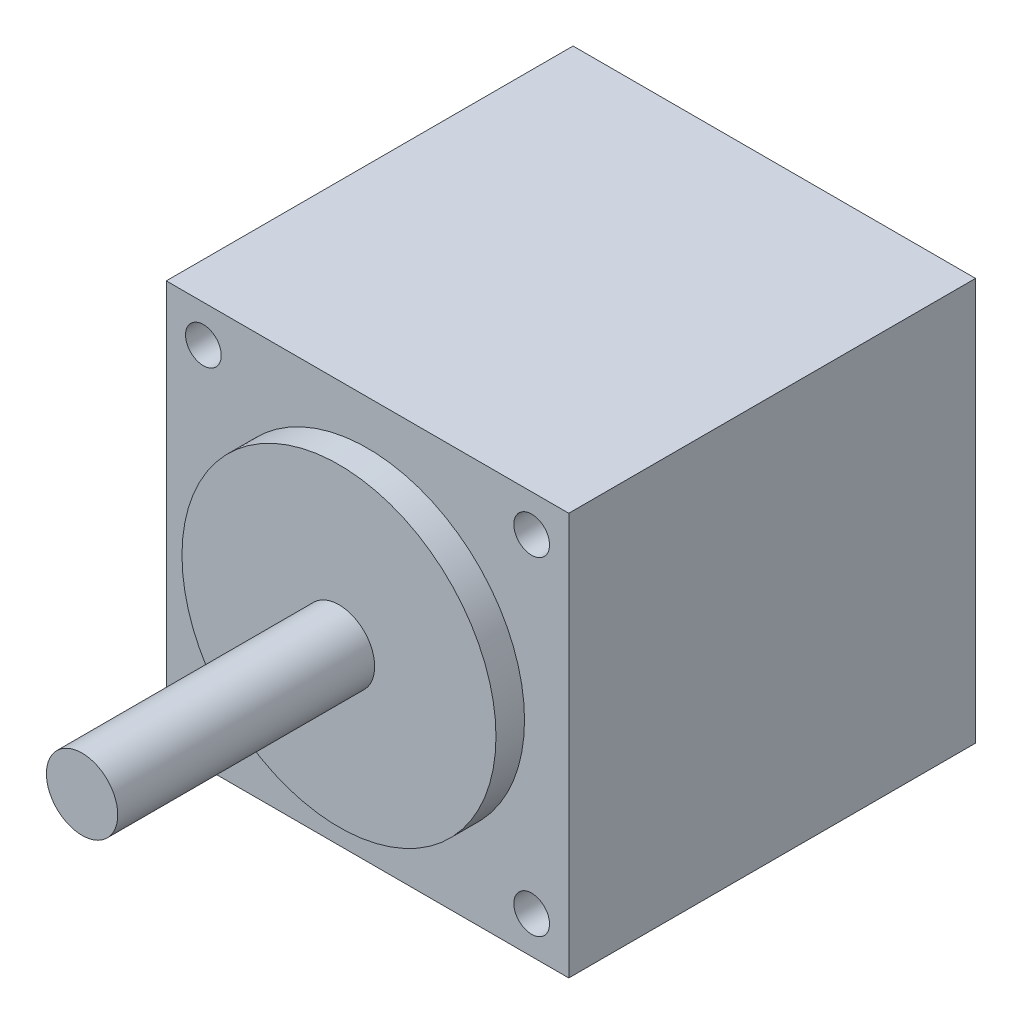
ISO-10303-21;
HEADER;
FILE_DESCRIPTION(('STEP AP214'),'2;1');
FILE_NAME('part.step','',(''),(''),'','','');
FILE_SCHEMA(('AUTOMOTIVE_DESIGN { 1 0 10303 214 1 1 1 1 }'));
ENDSEC;
DATA;
#1=APPLICATION_CONTEXT('core data for automotive mechanical design processes');
#2=APPLICATION_PROTOCOL_DEFINITION('international standard','automotive_design',2000,#1);
#3=PRODUCT_CONTEXT('',#1,'mechanical');
#4=PRODUCT('Part','Part','',(#3));
#5=PRODUCT_RELATED_PRODUCT_CATEGORY('part','',(#4));
#6=PRODUCT_DEFINITION_FORMATION('','',#4);
#7=PRODUCT_DEFINITION_CONTEXT('part definition',#1,'design');
#8=PRODUCT_DEFINITION('design','',#6,#7);
#9=PRODUCT_DEFINITION_SHAPE('','',#8);
#10=(LENGTH_UNIT() NAMED_UNIT(*) SI_UNIT(.MILLI.,.METRE.));
#11=(NAMED_UNIT(*) PLANE_ANGLE_UNIT() SI_UNIT($,.RADIAN.));
#12=(NAMED_UNIT(*) SI_UNIT($,.STERADIAN.) SOLID_ANGLE_UNIT());
#13=UNCERTAINTY_MEASURE_WITH_UNIT(LENGTH_MEASURE(1.E-05),#10,'distance_accuracy_value','');
#14=(GEOMETRIC_REPRESENTATION_CONTEXT(3) GLOBAL_UNCERTAINTY_ASSIGNED_CONTEXT((#13)) GLOBAL_UNIT_ASSIGNED_CONTEXT((#10,
#11,#12)) REPRESENTATION_CONTEXT('',''));
#15=CARTESIAN_POINT('',(0.,0.,0.));
#16=DIRECTION('',(0.,0.,1.));
#17=DIRECTION('',(1.,0.,0.));
#18=AXIS2_PLACEMENT_3D('',#15,#16,#17);
#19=CARTESIAN_POINT('',(14.1,0.,-28.5));
#20=DIRECTION('',(-1.,0.,0.));
#21=DIRECTION('',(0.,0.,1.));
#22=AXIS2_PLACEMENT_3D('',#19,#20,#21);
#23=PLANE('',#22);
#24=DIRECTION('',(0.,-1.,0.));
#25=VECTOR('',#24,1.);
#26=CARTESIAN_POINT('',(14.1,0.,0.));
#27=LINE('',#26,#25);
#28=CARTESIAN_POINT('',(14.1,14.1,0.));
#29=VERTEX_POINT('',#28);
#30=CARTESIAN_POINT('',(14.1,-14.1,0.));
#31=VERTEX_POINT('',#30);
#32=EDGE_CURVE('E122',#29,#31,#27,.T.);
#33=ORIENTED_EDGE('',*,*,#32,.T.);
#34=DIRECTION('',(0.,0.,1.));
#35=VECTOR('',#34,1.);
#36=CARTESIAN_POINT('',(14.1,-14.1,-28.5));
#37=LINE('',#36,#35);
#38=CARTESIAN_POINT('',(14.1,-14.1,-28.5));
#39=VERTEX_POINT('',#38);
#40=EDGE_CURVE('E12',#39,#31,#37,.T.);
#41=ORIENTED_EDGE('',*,*,#40,.F.);
#42=DIRECTION('',(0.,-1.,0.));
#43=VECTOR('',#42,1.);
#44=CARTESIAN_POINT('',(14.1,0.,-28.5));
#45=LINE('',#44,#43);
#46=CARTESIAN_POINT('',(14.1,14.1,-28.5));
#47=VERTEX_POINT('',#46);
#48=EDGE_CURVE('E63',#47,#39,#45,.T.);
#49=ORIENTED_EDGE('',*,*,#48,.F.);
#50=DIRECTION('',(0.,0.,1.));
#51=VECTOR('',#50,1.);
#52=CARTESIAN_POINT('',(14.1,14.1,-28.5));
#53=LINE('',#52,#51);
#54=EDGE_CURVE('E48',#47,#29,#53,.T.);
#55=ORIENTED_EDGE('',*,*,#54,.T.);
#56=EDGE_LOOP('',(#33,#41,#49,#55));
#57=FACE_BOUND('',#56,.T.);
#58=ADVANCED_FACE('F44',(#57),#23,.F.);
#59=CARTESIAN_POINT('',(0.,-14.1,-28.5));
#60=DIRECTION('',(0.,-1.,0.));
#61=DIRECTION('',(0.,0.,-1.));
#62=AXIS2_PLACEMENT_3D('',#59,#60,#61);
#63=PLANE('',#62);
#64=DIRECTION('',(1.,0.,0.));
#65=VECTOR('',#64,1.);
#66=CARTESIAN_POINT('',(0.,-14.1,0.));
#67=LINE('',#66,#65);
#68=CARTESIAN_POINT('',(-14.1,-14.1,0.));
#69=VERTEX_POINT('',#68);
#70=EDGE_CURVE('E127',#69,#31,#67,.T.);
#71=ORIENTED_EDGE('',*,*,#70,.F.);
#72=DIRECTION('',(0.,0.,1.));
#73=VECTOR('',#72,1.);
#74=CARTESIAN_POINT('',(-14.1,-14.1,-28.5));
#75=LINE('',#74,#73);
#76=CARTESIAN_POINT('',(-14.1,-14.1,-28.5));
#77=VERTEX_POINT('',#76);
#78=EDGE_CURVE('E54',#77,#69,#75,.T.);
#79=ORIENTED_EDGE('',*,*,#78,.F.);
#80=DIRECTION('',(1.,0.,0.));
#81=VECTOR('',#80,1.);
#82=CARTESIAN_POINT('',(0.,-14.1,-28.5));
#83=LINE('',#82,#81);
#84=EDGE_CURVE('E102',#77,#39,#83,.T.);
#85=ORIENTED_EDGE('',*,*,#84,.T.);
#86=ORIENTED_EDGE('',*,*,#40,.T.);
#87=EDGE_LOOP('',(#71,#79,#85,#86));
#88=FACE_BOUND('',#87,.T.);
#89=ADVANCED_FACE('F164',(#88),#63,.T.);
#90=CARTESIAN_POINT('',(-14.1,0.,-28.5));
#91=DIRECTION('',(-1.,0.,0.));
#92=DIRECTION('',(0.,0.,1.));
#93=AXIS2_PLACEMENT_3D('',#90,#91,#92);
#94=PLANE('',#93);
#95=DIRECTION('',(0.,-1.,0.));
#96=VECTOR('',#95,1.);
#97=CARTESIAN_POINT('',(-14.1,0.,0.));
#98=LINE('',#97,#96);
#99=CARTESIAN_POINT('',(-14.1,14.1,0.));
#100=VERTEX_POINT('',#99);
#101=EDGE_CURVE('E95',#100,#69,#98,.T.);
#102=ORIENTED_EDGE('',*,*,#101,.F.);
#103=DIRECTION('',(0.,0.,1.));
#104=VECTOR('',#103,1.);
#105=CARTESIAN_POINT('',(-14.1,14.1,-28.5));
#106=LINE('',#105,#104);
#107=CARTESIAN_POINT('',(-14.1,14.1,-28.5));
#108=VERTEX_POINT('',#107);
#109=EDGE_CURVE('E92',#108,#100,#106,.T.);
#110=ORIENTED_EDGE('',*,*,#109,.F.);
#111=DIRECTION('',(0.,-1.,0.));
#112=VECTOR('',#111,1.);
#113=CARTESIAN_POINT('',(-14.1,0.,-28.5));
#114=LINE('',#113,#112);
#115=EDGE_CURVE('E94',#108,#77,#114,.T.);
#116=ORIENTED_EDGE('',*,*,#115,.T.);
#117=ORIENTED_EDGE('',*,*,#78,.T.);
#118=EDGE_LOOP('',(#102,#110,#116,#117));
#119=FACE_BOUND('',#118,.T.);
#120=ADVANCED_FACE('F93',(#119),#94,.T.);
#121=CARTESIAN_POINT('',(-11.5,11.5,-28.5));
#122=DIRECTION('',(0.,0.,1.));
#123=DIRECTION('',(1.,0.,0.));
#124=AXIS2_PLACEMENT_3D('',#121,#122,#123);
#125=CYLINDRICAL_SURFACE('',#124,1.25);
#126=CARTESIAN_POINT('',(-11.5,11.5,-28.5));
#127=DIRECTION('',(0.,0.,1.));
#128=DIRECTION('',(1.,0.,0.));
#129=AXIS2_PLACEMENT_3D('',#126,#127,#128);
#130=CIRCLE('',#129,1.25);
#131=CARTESIAN_POINT('',(-10.25,11.5,-28.5));
#132=VERTEX_POINT('',#131);
#133=EDGE_CURVE('E147',#132,#132,#130,.T.);
#134=CARTESIAN_POINT('',(-11.5,11.5,0.));
#135=DIRECTION('',(0.,0.,1.));
#136=DIRECTION('',(1.,0.,0.));
#137=AXIS2_PLACEMENT_3D('',#134,#135,#136);
#138=CIRCLE('',#137,1.25);
#139=CARTESIAN_POINT('',(-10.25,11.5,0.));
#140=VERTEX_POINT('',#139);
#141=EDGE_CURVE('E119',#140,#140,#138,.T.);
#142=CARTESIAN_POINT('',(-10.25,11.5,-28.5));
#143=CARTESIAN_POINT('',(-10.25,11.5,-28.203125));
#144=CARTESIAN_POINT('',(-10.25,11.5,-27.90625));
#145=CARTESIAN_POINT('',(-10.25,11.5,-27.3125));
#146=CARTESIAN_POINT('',(-10.25,11.5,-27.015625));
#147=CARTESIAN_POINT('',(-10.25,11.5,-26.421875));
#148=CARTESIAN_POINT('',(-10.25,11.5,-26.125));
#149=CARTESIAN_POINT('',(-10.25,11.5,-25.53125));
#150=CARTESIAN_POINT('',(-10.25,11.5,-25.234375));
#151=CARTESIAN_POINT('',(-10.25,11.5,-24.640625));
#152=CARTESIAN_POINT('',(-10.25,11.5,-24.34375));
#153=CARTESIAN_POINT('',(-10.25,11.5,-23.75));
#154=CARTESIAN_POINT('',(-10.25,11.5,-23.453125));
#155=CARTESIAN_POINT('',(-10.25,11.5,-22.859375));
#156=CARTESIAN_POINT('',(-10.25,11.5,-22.5625));
#157=CARTESIAN_POINT('',(-10.25,11.5,-21.96875));
#158=CARTESIAN_POINT('',(-10.25,11.5,-21.671875));
#159=CARTESIAN_POINT('',(-10.25,11.5,-21.078125));
#160=CARTESIAN_POINT('',(-10.25,11.5,-20.78125));
#161=CARTESIAN_POINT('',(-10.25,11.5,-20.1875));
#162=CARTESIAN_POINT('',(-10.25,11.5,-19.890625));
#163=CARTESIAN_POINT('',(-10.25,11.5,-19.296875));
#164=CARTESIAN_POINT('',(-10.25,11.5,-19.));
#165=CARTESIAN_POINT('',(-10.25,11.5,-18.40625));
#166=CARTESIAN_POINT('',(-10.25,11.5,-18.109375));
#167=CARTESIAN_POINT('',(-10.25,11.5,-17.515625));
#168=CARTESIAN_POINT('',(-10.25,11.5,-17.21875));
#169=CARTESIAN_POINT('',(-10.25,11.5,-16.625));
#170=CARTESIAN_POINT('',(-10.25,11.5,-16.328125));
#171=CARTESIAN_POINT('',(-10.25,11.5,-15.734375));
#172=CARTESIAN_POINT('',(-10.25,11.5,-15.4375));
#173=CARTESIAN_POINT('',(-10.25,11.5,-14.84375));
#174=CARTESIAN_POINT('',(-10.25,11.5,-14.546875));
#175=CARTESIAN_POINT('',(-10.25,11.5,-13.953125));
#176=CARTESIAN_POINT('',(-10.25,11.5,-13.65625));
#177=CARTESIAN_POINT('',(-10.25,11.5,-13.0625));
#178=CARTESIAN_POINT('',(-10.25,11.5,-12.765625));
#179=CARTESIAN_POINT('',(-10.25,11.5,-12.171875));
#180=CARTESIAN_POINT('',(-10.25,11.5,-11.875));
#181=CARTESIAN_POINT('',(-10.25,11.5,-11.28125));
#182=CARTESIAN_POINT('',(-10.25,11.5,-10.984375));
#183=CARTESIAN_POINT('',(-10.25,11.5,-10.390625));
#184=CARTESIAN_POINT('',(-10.25,11.5,-10.09375));
#185=CARTESIAN_POINT('',(-10.25,11.5,-9.5));
#186=CARTESIAN_POINT('',(-10.25,11.5,-9.203125));
#187=CARTESIAN_POINT('',(-10.25,11.5,-8.609375));
#188=CARTESIAN_POINT('',(-10.25,11.5,-8.3125));
#189=CARTESIAN_POINT('',(-10.25,11.5,-7.71875));
#190=CARTESIAN_POINT('',(-10.25,11.5,-7.421875));
#191=CARTESIAN_POINT('',(-10.25,11.5,-6.828125));
#192=CARTESIAN_POINT('',(-10.25,11.5,-6.53125));
#193=CARTESIAN_POINT('',(-10.25,11.5,-5.9375));
#194=CARTESIAN_POINT('',(-10.25,11.5,-5.640625));
#195=CARTESIAN_POINT('',(-10.25,11.5,-5.046875));
#196=CARTESIAN_POINT('',(-10.25,11.5,-4.75));
#197=CARTESIAN_POINT('',(-10.25,11.5,-4.15625));
#198=CARTESIAN_POINT('',(-10.25,11.5,-3.859375));
#199=CARTESIAN_POINT('',(-10.25,11.5,-3.265625));
#200=CARTESIAN_POINT('',(-10.25,11.5,-2.96875));
#201=CARTESIAN_POINT('',(-10.25,11.5,-2.375));
#202=CARTESIAN_POINT('',(-10.25,11.5,-2.078125));
#203=CARTESIAN_POINT('',(-10.25,11.5,-1.484375));
#204=CARTESIAN_POINT('',(-10.25,11.5,-1.1875));
#205=CARTESIAN_POINT('',(-10.25,11.5,-0.593749999999999));
#206=CARTESIAN_POINT('',(-10.25,11.5,-0.296875));
#207=CARTESIAN_POINT('',(-10.25,11.5,0.));
#208=B_SPLINE_CURVE_WITH_KNOTS('',3,(#142,#143,#144,#145,#146,#147,#148,#149,#150,#151,#152,
#153,#154,#155,#156,#157,#158,#159,#160,#161,#162,#163,#164,#165,#166,#167,#168,#169,#170,#171,
#172,#173,#174,#175,#176,#177,#178,#179,#180,#181,#182,#183,#184,#185,#186,#187,#188,#189,#190,
#191,#192,#193,#194,#195,#196,#197,#198,#199,#200,#201,#202,#203,#204,#205,#206,#207),
.UNSPECIFIED.,.F.,.F.,(4,2,2,2,2,2,2,2,2,2,2,2,2,2,2,2,2,2,2,2,2,2,2,2,2,2,2,2,2,2,2,2,4),(0.,
0.890625000000003,1.78125,2.671875,3.5625,4.453125,5.34375,6.234375,7.125,8.015625,8.90625,
9.796875,10.6875,11.578125,12.46875,13.359375,14.25,15.140625,16.03125,16.921875,17.8125,
18.703125,19.59375,20.484375,21.375,22.265625,23.15625,24.046875,24.9375,25.828125,26.71875,
27.609375,28.5),.UNSPECIFIED.);
#209=EDGE_CURVE('BSEAM152',#132,#140,#208,.T.);
#210=ORIENTED_EDGE('',*,*,#133,.F.);
#211=ORIENTED_EDGE('',*,*,#141,.T.);
#212=ORIENTED_EDGE('',*,*,#209,.T.);
#213=ORIENTED_EDGE('',*,*,#209,.F.);
#214=EDGE_LOOP('',(#210,#212,#211,#213));
#215=FACE_BOUND('',#214,.T.);
#216=ADVANCED_FACE('F152',(#215),#125,.F.);
#217=CARTESIAN_POINT('',(11.5,11.5,-28.5));
#218=DIRECTION('',(0.,0.,1.));
#219=DIRECTION('',(1.,0.,0.));
#220=AXIS2_PLACEMENT_3D('',#217,#218,#219);
#221=CYLINDRICAL_SURFACE('',#220,1.25);
#222=CARTESIAN_POINT('',(11.5,11.5,-28.5));
#223=DIRECTION('',(0.,0.,1.));
#224=DIRECTION('',(1.,0.,0.));
#225=AXIS2_PLACEMENT_3D('',#222,#223,#224);
#226=CIRCLE('',#225,1.25);
#227=CARTESIAN_POINT('',(12.75,11.5,-28.5));
#228=VERTEX_POINT('',#227);
#229=EDGE_CURVE('E144',#228,#228,#226,.T.);
#230=CARTESIAN_POINT('',(11.5,11.5,0.));
#231=DIRECTION('',(0.,0.,1.));
#232=DIRECTION('',(1.,0.,0.));
#233=AXIS2_PLACEMENT_3D('',#230,#231,#232);
#234=CIRCLE('',#233,1.25);
#235=CARTESIAN_POINT('',(12.75,11.5,0.));
#236=VERTEX_POINT('',#235);
#237=EDGE_CURVE('E116',#236,#236,#234,.T.);
#238=CARTESIAN_POINT('',(12.75,11.5,-28.5));
#239=CARTESIAN_POINT('',(12.75,11.5,-28.203125));
#240=CARTESIAN_POINT('',(12.75,11.5,-27.90625));
#241=CARTESIAN_POINT('',(12.75,11.5,-27.3125));
#242=CARTESIAN_POINT('',(12.75,11.5,-27.015625));
#243=CARTESIAN_POINT('',(12.75,11.5,-26.421875));
#244=CARTESIAN_POINT('',(12.75,11.5,-26.125));
#245=CARTESIAN_POINT('',(12.75,11.5,-25.53125));
#246=CARTESIAN_POINT('',(12.75,11.5,-25.234375));
#247=CARTESIAN_POINT('',(12.75,11.5,-24.640625));
#248=CARTESIAN_POINT('',(12.75,11.5,-24.34375));
#249=CARTESIAN_POINT('',(12.75,11.5,-23.75));
#250=CARTESIAN_POINT('',(12.75,11.5,-23.453125));
#251=CARTESIAN_POINT('',(12.75,11.5,-22.859375));
#252=CARTESIAN_POINT('',(12.75,11.5,-22.5625));
#253=CARTESIAN_POINT('',(12.75,11.5,-21.96875));
#254=CARTESIAN_POINT('',(12.75,11.5,-21.671875));
#255=CARTESIAN_POINT('',(12.75,11.5,-21.078125));
#256=CARTESIAN_POINT('',(12.75,11.5,-20.78125));
#257=CARTESIAN_POINT('',(12.75,11.5,-20.1875));
#258=CARTESIAN_POINT('',(12.75,11.5,-19.890625));
#259=CARTESIAN_POINT('',(12.75,11.5,-19.296875));
#260=CARTESIAN_POINT('',(12.75,11.5,-19.));
#261=CARTESIAN_POINT('',(12.75,11.5,-18.40625));
#262=CARTESIAN_POINT('',(12.75,11.5,-18.109375));
#263=CARTESIAN_POINT('',(12.75,11.5,-17.515625));
#264=CARTESIAN_POINT('',(12.75,11.5,-17.21875));
#265=CARTESIAN_POINT('',(12.75,11.5,-16.625));
#266=CARTESIAN_POINT('',(12.75,11.5,-16.328125));
#267=CARTESIAN_POINT('',(12.75,11.5,-15.734375));
#268=CARTESIAN_POINT('',(12.75,11.5,-15.4375));
#269=CARTESIAN_POINT('',(12.75,11.5,-14.84375));
#270=CARTESIAN_POINT('',(12.75,11.5,-14.546875));
#271=CARTESIAN_POINT('',(12.75,11.5,-13.953125));
#272=CARTESIAN_POINT('',(12.75,11.5,-13.65625));
#273=CARTESIAN_POINT('',(12.75,11.5,-13.0625));
#274=CARTESIAN_POINT('',(12.75,11.5,-12.765625));
#275=CARTESIAN_POINT('',(12.75,11.5,-12.171875));
#276=CARTESIAN_POINT('',(12.75,11.5,-11.875));
#277=CARTESIAN_POINT('',(12.75,11.5,-11.28125));
#278=CARTESIAN_POINT('',(12.75,11.5,-10.984375));
#279=CARTESIAN_POINT('',(12.75,11.5,-10.390625));
#280=CARTESIAN_POINT('',(12.75,11.5,-10.09375));
#281=CARTESIAN_POINT('',(12.75,11.5,-9.5));
#282=CARTESIAN_POINT('',(12.75,11.5,-9.203125));
#283=CARTESIAN_POINT('',(12.75,11.5,-8.609375));
#284=CARTESIAN_POINT('',(12.75,11.5,-8.3125));
#285=CARTESIAN_POINT('',(12.75,11.5,-7.71875));
#286=CARTESIAN_POINT('',(12.75,11.5,-7.421875));
#287=CARTESIAN_POINT('',(12.75,11.5,-6.828125));
#288=CARTESIAN_POINT('',(12.75,11.5,-6.53125));
#289=CARTESIAN_POINT('',(12.75,11.5,-5.9375));
#290=CARTESIAN_POINT('',(12.75,11.5,-5.640625));
#291=CARTESIAN_POINT('',(12.75,11.5,-5.046875));
#292=CARTESIAN_POINT('',(12.75,11.5,-4.75));
#293=CARTESIAN_POINT('',(12.75,11.5,-4.15625));
#294=CARTESIAN_POINT('',(12.75,11.5,-3.859375));
#295=CARTESIAN_POINT('',(12.75,11.5,-3.265625));
#296=CARTESIAN_POINT('',(12.75,11.5,-2.96875));
#297=CARTESIAN_POINT('',(12.75,11.5,-2.375));
#298=CARTESIAN_POINT('',(12.75,11.5,-2.078125));
#299=CARTESIAN_POINT('',(12.75,11.5,-1.484375));
#300=CARTESIAN_POINT('',(12.75,11.5,-1.1875));
#301=CARTESIAN_POINT('',(12.75,11.5,-0.593749999999999));
#302=CARTESIAN_POINT('',(12.75,11.5,-0.296875));
#303=CARTESIAN_POINT('',(12.75,11.5,0.));
#304=B_SPLINE_CURVE_WITH_KNOTS('',3,(#238,#239,#240,#241,#242,#243,#244,#245,#246,#247,#248,
#249,#250,#251,#252,#253,#254,#255,#256,#257,#258,#259,#260,#261,#262,#263,#264,#265,#266,#267,
#268,#269,#270,#271,#272,#273,#274,#275,#276,#277,#278,#279,#280,#281,#282,#283,#284,#285,#286,
#287,#288,#289,#290,#291,#292,#293,#294,#295,#296,#297,#298,#299,#300,#301,#302,#303),
.UNSPECIFIED.,.F.,.F.,(4,2,2,2,2,2,2,2,2,2,2,2,2,2,2,2,2,2,2,2,2,2,2,2,2,2,2,2,2,2,2,2,4),(0.,
0.890625000000003,1.78125,2.671875,3.5625,4.453125,5.34375,6.234375,7.125,8.015625,8.90625,
9.796875,10.6875,11.578125,12.46875,13.359375,14.25,15.140625,16.03125,16.921875,17.8125,
18.703125,19.59375,20.484375,21.375,22.265625,23.15625,24.046875,24.9375,25.828125,26.71875,
27.609375,28.5),.UNSPECIFIED.);
#305=EDGE_CURVE('BSEAM155',#228,#236,#304,.T.);
#306=ORIENTED_EDGE('',*,*,#229,.F.);
#307=ORIENTED_EDGE('',*,*,#237,.T.);
#308=ORIENTED_EDGE('',*,*,#305,.T.);
#309=ORIENTED_EDGE('',*,*,#305,.F.);
#310=EDGE_LOOP('',(#306,#308,#307,#309));
#311=FACE_BOUND('',#310,.T.);
#312=ADVANCED_FACE('F155',(#311),#221,.F.);
#313=CARTESIAN_POINT('',(11.5000000000002,-11.5,-28.5));
#314=DIRECTION('',(0.,0.,1.));
#315=DIRECTION('',(1.,0.,0.));
#316=AXIS2_PLACEMENT_3D('',#313,#314,#315);
#317=CYLINDRICAL_SURFACE('',#316,1.25);
#318=CARTESIAN_POINT('',(11.5000000000002,-11.5,-28.5));
#319=DIRECTION('',(0.,0.,1.));
#320=DIRECTION('',(1.,0.,0.));
#321=AXIS2_PLACEMENT_3D('',#318,#319,#320);
#322=CIRCLE('',#321,1.25);
#323=CARTESIAN_POINT('',(12.7500000000002,-11.5,-28.5));
#324=VERTEX_POINT('',#323);
#325=EDGE_CURVE('E139',#324,#324,#322,.T.);
#326=CARTESIAN_POINT('',(11.5000000000002,-11.5,0.));
#327=DIRECTION('',(0.,0.,1.));
#328=DIRECTION('',(1.,0.,0.));
#329=AXIS2_PLACEMENT_3D('',#326,#327,#328);
#330=CIRCLE('',#329,1.25);
#331=CARTESIAN_POINT('',(12.7500000000002,-11.5,0.));
#332=VERTEX_POINT('',#331);
#333=EDGE_CURVE('E113',#332,#332,#330,.T.);
#334=CARTESIAN_POINT('',(12.7500000000002,-11.5,-28.5));
#335=CARTESIAN_POINT('',(12.7500000000002,-11.5,-28.203125));
#336=CARTESIAN_POINT('',(12.7500000000002,-11.5,-27.90625));
#337=CARTESIAN_POINT('',(12.7500000000002,-11.5,-27.3125));
#338=CARTESIAN_POINT('',(12.7500000000002,-11.5,-27.015625));
#339=CARTESIAN_POINT('',(12.7500000000002,-11.5,-26.421875));
#340=CARTESIAN_POINT('',(12.7500000000002,-11.5,-26.125));
#341=CARTESIAN_POINT('',(12.7500000000002,-11.5,-25.53125));
#342=CARTESIAN_POINT('',(12.7500000000002,-11.5,-25.234375));
#343=CARTESIAN_POINT('',(12.7500000000002,-11.5,-24.640625));
#344=CARTESIAN_POINT('',(12.7500000000002,-11.5,-24.34375));
#345=CARTESIAN_POINT('',(12.7500000000002,-11.5,-23.75));
#346=CARTESIAN_POINT('',(12.7500000000002,-11.5,-23.453125));
#347=CARTESIAN_POINT('',(12.7500000000002,-11.5,-22.859375));
#348=CARTESIAN_POINT('',(12.7500000000002,-11.5,-22.5625));
#349=CARTESIAN_POINT('',(12.7500000000002,-11.5,-21.96875));
#350=CARTESIAN_POINT('',(12.7500000000002,-11.5,-21.671875));
#351=CARTESIAN_POINT('',(12.7500000000002,-11.5,-21.078125));
#352=CARTESIAN_POINT('',(12.7500000000002,-11.5,-20.78125));
#353=CARTESIAN_POINT('',(12.7500000000002,-11.5,-20.1875));
#354=CARTESIAN_POINT('',(12.7500000000002,-11.5,-19.890625));
#355=CARTESIAN_POINT('',(12.7500000000002,-11.5,-19.296875));
#356=CARTESIAN_POINT('',(12.7500000000002,-11.5,-19.));
#357=CARTESIAN_POINT('',(12.7500000000002,-11.5,-18.40625));
#358=CARTESIAN_POINT('',(12.7500000000002,-11.5,-18.109375));
#359=CARTESIAN_POINT('',(12.7500000000002,-11.5,-17.515625));
#360=CARTESIAN_POINT('',(12.7500000000002,-11.5,-17.21875));
#361=CARTESIAN_POINT('',(12.7500000000002,-11.5,-16.625));
#362=CARTESIAN_POINT('',(12.7500000000002,-11.5,-16.328125));
#363=CARTESIAN_POINT('',(12.7500000000002,-11.5,-15.734375));
#364=CARTESIAN_POINT('',(12.7500000000002,-11.5,-15.4375));
#365=CARTESIAN_POINT('',(12.7500000000002,-11.5,-14.84375));
#366=CARTESIAN_POINT('',(12.7500000000002,-11.5,-14.546875));
#367=CARTESIAN_POINT('',(12.7500000000002,-11.5,-13.953125));
#368=CARTESIAN_POINT('',(12.7500000000002,-11.5,-13.65625));
#369=CARTESIAN_POINT('',(12.7500000000002,-11.5,-13.0625));
#370=CARTESIAN_POINT('',(12.7500000000002,-11.5,-12.765625));
#371=CARTESIAN_POINT('',(12.7500000000002,-11.5,-12.171875));
#372=CARTESIAN_POINT('',(12.7500000000002,-11.5,-11.875));
#373=CARTESIAN_POINT('',(12.7500000000002,-11.5,-11.28125));
#374=CARTESIAN_POINT('',(12.7500000000002,-11.5,-10.984375));
#375=CARTESIAN_POINT('',(12.7500000000002,-11.5,-10.390625));
#376=CARTESIAN_POINT('',(12.7500000000002,-11.5,-10.09375));
#377=CARTESIAN_POINT('',(12.7500000000002,-11.5,-9.5));
#378=CARTESIAN_POINT('',(12.7500000000002,-11.5,-9.203125));
#379=CARTESIAN_POINT('',(12.7500000000002,-11.5,-8.609375));
#380=CARTESIAN_POINT('',(12.7500000000002,-11.5,-8.3125));
#381=CARTESIAN_POINT('',(12.7500000000002,-11.5,-7.71875));
#382=CARTESIAN_POINT('',(12.7500000000002,-11.5,-7.421875));
#383=CARTESIAN_POINT('',(12.7500000000002,-11.5,-6.828125));
#384=CARTESIAN_POINT('',(12.7500000000002,-11.5,-6.53125));
#385=CARTESIAN_POINT('',(12.7500000000002,-11.5,-5.9375));
#386=CARTESIAN_POINT('',(12.7500000000002,-11.5,-5.640625));
#387=CARTESIAN_POINT('',(12.7500000000002,-11.5,-5.046875));
#388=CARTESIAN_POINT('',(12.7500000000002,-11.5,-4.75));
#389=CARTESIAN_POINT('',(12.7500000000002,-11.5,-4.15625));
#390=CARTESIAN_POINT('',(12.7500000000002,-11.5,-3.859375));
#391=CARTESIAN_POINT('',(12.7500000000002,-11.5,-3.265625));
#392=CARTESIAN_POINT('',(12.7500000000002,-11.5,-2.96875));
#393=CARTESIAN_POINT('',(12.7500000000002,-11.5,-2.375));
#394=CARTESIAN_POINT('',(12.7500000000002,-11.5,-2.078125));
#395=CARTESIAN_POINT('',(12.7500000000002,-11.5,-1.484375));
#396=CARTESIAN_POINT('',(12.7500000000002,-11.5,-1.1875));
#397=CARTESIAN_POINT('',(12.7500000000002,-11.5,-0.593749999999999));
#398=CARTESIAN_POINT('',(12.7500000000002,-11.5,-0.296875));
#399=CARTESIAN_POINT('',(12.7500000000002,-11.5,0.));
#400=B_SPLINE_CURVE_WITH_KNOTS('',3,(#334,#335,#336,#337,#338,#339,#340,#341,#342,#343,#344,
#345,#346,#347,#348,#349,#350,#351,#352,#353,#354,#355,#356,#357,#358,#359,#360,#361,#362,#363,
#364,#365,#366,#367,#368,#369,#370,#371,#372,#373,#374,#375,#376,#377,#378,#379,#380,#381,#382,
#383,#384,#385,#386,#387,#388,#389,#390,#391,#392,#393,#394,#395,#396,#397,#398,#399),
.UNSPECIFIED.,.F.,.F.,(4,2,2,2,2,2,2,2,2,2,2,2,2,2,2,2,2,2,2,2,2,2,2,2,2,2,2,2,2,2,2,2,4),(0.,
0.890625000000003,1.78125,2.671875,3.5625,4.453125,5.34375,6.234375,7.125,8.015625,8.90625,
9.796875,10.6875,11.578125,12.46875,13.359375,14.25,15.140625,16.03125,16.921875,17.8125,
18.703125,19.59375,20.484375,21.375,22.265625,23.15625,24.046875,24.9375,25.828125,26.71875,
27.609375,28.5),.UNSPECIFIED.);
#401=EDGE_CURVE('BSEAM179',#324,#332,#400,.T.);
#402=ORIENTED_EDGE('',*,*,#325,.F.);
#403=ORIENTED_EDGE('',*,*,#333,.T.);
#404=ORIENTED_EDGE('',*,*,#401,.T.);
#405=ORIENTED_EDGE('',*,*,#401,.F.);
#406=EDGE_LOOP('',(#402,#404,#403,#405));
#407=FACE_BOUND('',#406,.T.);
#408=ADVANCED_FACE('F179',(#407),#317,.F.);
#409=CARTESIAN_POINT('',(-11.4999999999998,-11.5,-28.5));
#410=DIRECTION('',(0.,0.,1.));
#411=DIRECTION('',(1.,0.,0.));
#412=AXIS2_PLACEMENT_3D('',#409,#410,#411);
#413=CYLINDRICAL_SURFACE('',#412,1.25);
#414=CARTESIAN_POINT('',(-11.4999999999998,-11.5,-28.5));
#415=DIRECTION('',(0.,0.,1.));
#416=DIRECTION('',(1.,0.,0.));
#417=AXIS2_PLACEMENT_3D('',#414,#415,#416);
#418=CIRCLE('',#417,1.25);
#419=CARTESIAN_POINT('',(-10.2499999999998,-11.5,-28.5));
#420=VERTEX_POINT('',#419);
#421=EDGE_CURVE('E134',#420,#420,#418,.T.);
#422=CARTESIAN_POINT('',(-11.4999999999998,-11.5,0.));
#423=DIRECTION('',(0.,0.,1.));
#424=DIRECTION('',(1.,0.,0.));
#425=AXIS2_PLACEMENT_3D('',#422,#423,#424);
#426=CIRCLE('',#425,1.25);
#427=CARTESIAN_POINT('',(-10.2499999999998,-11.5,0.));
#428=VERTEX_POINT('',#427);
#429=EDGE_CURVE('E110',#428,#428,#426,.T.);
#430=CARTESIAN_POINT('',(-10.2499999999998,-11.5,-28.5));
#431=CARTESIAN_POINT('',(-10.2499999999998,-11.5,-28.203125));
#432=CARTESIAN_POINT('',(-10.2499999999998,-11.5,-27.90625));
#433=CARTESIAN_POINT('',(-10.2499999999998,-11.5,-27.3125));
#434=CARTESIAN_POINT('',(-10.2499999999998,-11.5,-27.015625));
#435=CARTESIAN_POINT('',(-10.2499999999998,-11.5,-26.421875));
#436=CARTESIAN_POINT('',(-10.2499999999998,-11.5,-26.125));
#437=CARTESIAN_POINT('',(-10.2499999999998,-11.5,-25.53125));
#438=CARTESIAN_POINT('',(-10.2499999999998,-11.5,-25.234375));
#439=CARTESIAN_POINT('',(-10.2499999999998,-11.5,-24.640625));
#440=CARTESIAN_POINT('',(-10.2499999999998,-11.5,-24.34375));
#441=CARTESIAN_POINT('',(-10.2499999999998,-11.5,-23.75));
#442=CARTESIAN_POINT('',(-10.2499999999998,-11.5,-23.453125));
#443=CARTESIAN_POINT('',(-10.2499999999998,-11.5,-22.859375));
#444=CARTESIAN_POINT('',(-10.2499999999998,-11.5,-22.5625));
#445=CARTESIAN_POINT('',(-10.2499999999998,-11.5,-21.96875));
#446=CARTESIAN_POINT('',(-10.2499999999998,-11.5,-21.671875));
#447=CARTESIAN_POINT('',(-10.2499999999998,-11.5,-21.078125));
#448=CARTESIAN_POINT('',(-10.2499999999998,-11.5,-20.78125));
#449=CARTESIAN_POINT('',(-10.2499999999998,-11.5,-20.1875));
#450=CARTESIAN_POINT('',(-10.2499999999998,-11.5,-19.890625));
#451=CARTESIAN_POINT('',(-10.2499999999998,-11.5,-19.296875));
#452=CARTESIAN_POINT('',(-10.2499999999998,-11.5,-19.));
#453=CARTESIAN_POINT('',(-10.2499999999998,-11.5,-18.40625));
#454=CARTESIAN_POINT('',(-10.2499999999998,-11.5,-18.109375));
#455=CARTESIAN_POINT('',(-10.2499999999998,-11.5,-17.515625));
#456=CARTESIAN_POINT('',(-10.2499999999998,-11.5,-17.21875));
#457=CARTESIAN_POINT('',(-10.2499999999998,-11.5,-16.625));
#458=CARTESIAN_POINT('',(-10.2499999999998,-11.5,-16.328125));
#459=CARTESIAN_POINT('',(-10.2499999999998,-11.5,-15.734375));
#460=CARTESIAN_POINT('',(-10.2499999999998,-11.5,-15.4375));
#461=CARTESIAN_POINT('',(-10.2499999999998,-11.5,-14.84375));
#462=CARTESIAN_POINT('',(-10.2499999999998,-11.5,-14.546875));
#463=CARTESIAN_POINT('',(-10.2499999999998,-11.5,-13.953125));
#464=CARTESIAN_POINT('',(-10.2499999999998,-11.5,-13.65625));
#465=CARTESIAN_POINT('',(-10.2499999999998,-11.5,-13.0625));
#466=CARTESIAN_POINT('',(-10.2499999999998,-11.5,-12.765625));
#467=CARTESIAN_POINT('',(-10.2499999999998,-11.5,-12.171875));
#468=CARTESIAN_POINT('',(-10.2499999999998,-11.5,-11.875));
#469=CARTESIAN_POINT('',(-10.2499999999998,-11.5,-11.28125));
#470=CARTESIAN_POINT('',(-10.2499999999998,-11.5,-10.984375));
#471=CARTESIAN_POINT('',(-10.2499999999998,-11.5,-10.390625));
#472=CARTESIAN_POINT('',(-10.2499999999998,-11.5,-10.09375));
#473=CARTESIAN_POINT('',(-10.2499999999998,-11.5,-9.5));
#474=CARTESIAN_POINT('',(-10.2499999999998,-11.5,-9.203125));
#475=CARTESIAN_POINT('',(-10.2499999999998,-11.5,-8.609375));
#476=CARTESIAN_POINT('',(-10.2499999999998,-11.5,-8.3125));
#477=CARTESIAN_POINT('',(-10.2499999999998,-11.5,-7.71875));
#478=CARTESIAN_POINT('',(-10.2499999999998,-11.5,-7.421875));
#479=CARTESIAN_POINT('',(-10.2499999999998,-11.5,-6.828125));
#480=CARTESIAN_POINT('',(-10.2499999999998,-11.5,-6.53125));
#481=CARTESIAN_POINT('',(-10.2499999999998,-11.5,-5.9375));
#482=CARTESIAN_POINT('',(-10.2499999999998,-11.5,-5.640625));
#483=CARTESIAN_POINT('',(-10.2499999999998,-11.5,-5.046875));
#484=CARTESIAN_POINT('',(-10.2499999999998,-11.5,-4.75));
#485=CARTESIAN_POINT('',(-10.2499999999998,-11.5,-4.15625));
#486=CARTESIAN_POINT('',(-10.2499999999998,-11.5,-3.859375));
#487=CARTESIAN_POINT('',(-10.2499999999998,-11.5,-3.265625));
#488=CARTESIAN_POINT('',(-10.2499999999998,-11.5,-2.96875));
#489=CARTESIAN_POINT('',(-10.2499999999998,-11.5,-2.375));
#490=CARTESIAN_POINT('',(-10.2499999999998,-11.5,-2.078125));
#491=CARTESIAN_POINT('',(-10.2499999999998,-11.5,-1.484375));
#492=CARTESIAN_POINT('',(-10.2499999999998,-11.5,-1.1875));
#493=CARTESIAN_POINT('',(-10.2499999999998,-11.5,-0.593749999999999));
#494=CARTESIAN_POINT('',(-10.2499999999998,-11.5,-0.296875));
#495=CARTESIAN_POINT('',(-10.2499999999998,-11.5,0.));
#496=B_SPLINE_CURVE_WITH_KNOTS('',3,(#430,#431,#432,#433,#434,#435,#436,#437,#438,#439,#440,
#441,#442,#443,#444,#445,#446,#447,#448,#449,#450,#451,#452,#453,#454,#455,#456,#457,#458,#459,
#460,#461,#462,#463,#464,#465,#466,#467,#468,#469,#470,#471,#472,#473,#474,#475,#476,#477,#478,
#479,#480,#481,#482,#483,#484,#485,#486,#487,#488,#489,#490,#491,#492,#493,#494,#495),
.UNSPECIFIED.,.F.,.F.,(4,2,2,2,2,2,2,2,2,2,2,2,2,2,2,2,2,2,2,2,2,2,2,2,2,2,2,2,2,2,2,2,4),(0.,
0.890625000000003,1.78125,2.671875,3.5625,4.453125,5.34375,6.234375,7.125,8.015625,8.90625,
9.796875,10.6875,11.578125,12.46875,13.359375,14.25,15.140625,16.03125,16.921875,17.8125,
18.703125,19.59375,20.484375,21.375,22.265625,23.15625,24.046875,24.9375,25.828125,26.71875,
27.609375,28.5),.UNSPECIFIED.);
#497=EDGE_CURVE('BSEAM182',#420,#428,#496,.T.);
#498=ORIENTED_EDGE('',*,*,#421,.F.);
#499=ORIENTED_EDGE('',*,*,#429,.T.);
#500=ORIENTED_EDGE('',*,*,#497,.T.);
#501=ORIENTED_EDGE('',*,*,#497,.F.);
#502=EDGE_LOOP('',(#498,#500,#499,#501));
#503=FACE_BOUND('',#502,.T.);
#504=ADVANCED_FACE('F182',(#503),#413,.F.);
#505=CARTESIAN_POINT('',(0.,0.,-28.5));
#506=DIRECTION('',(0.,0.,1.));
#507=DIRECTION('',(1.,0.,0.));
#508=AXIS2_PLACEMENT_3D('',#505,#506,#507);
#509=CYLINDRICAL_SURFACE('',#508,11.);
#510=CARTESIAN_POINT('',(0.,0.,-28.5));
#511=DIRECTION('',(0.,0.,1.));
#512=DIRECTION('',(1.,0.,0.));
#513=AXIS2_PLACEMENT_3D('',#510,#511,#512);
#514=CIRCLE('',#513,11.);
#515=CARTESIAN_POINT('',(11.,0.,-28.5));
#516=VERTEX_POINT('',#515);
#517=EDGE_CURVE('E129',#516,#516,#514,.T.);
#518=CARTESIAN_POINT('',(0.,0.,0.));
#519=DIRECTION('',(0.,0.,1.));
#520=DIRECTION('',(1.,0.,0.));
#521=AXIS2_PLACEMENT_3D('',#518,#519,#520);
#522=CIRCLE('',#521,11.);
#523=CARTESIAN_POINT('',(11.,0.,0.));
#524=VERTEX_POINT('',#523);
#525=EDGE_CURVE('E107',#524,#524,#522,.T.);
#526=CARTESIAN_POINT('',(11.,0.,-28.5));
#527=CARTESIAN_POINT('',(11.,0.,-28.203125));
#528=CARTESIAN_POINT('',(11.,0.,-27.90625));
#529=CARTESIAN_POINT('',(11.,0.,-27.3125));
#530=CARTESIAN_POINT('',(11.,0.,-27.015625));
#531=CARTESIAN_POINT('',(11.,0.,-26.421875));
#532=CARTESIAN_POINT('',(11.,0.,-26.125));
#533=CARTESIAN_POINT('',(11.,0.,-25.53125));
#534=CARTESIAN_POINT('',(11.,0.,-25.234375));
#535=CARTESIAN_POINT('',(11.,0.,-24.640625));
#536=CARTESIAN_POINT('',(11.,0.,-24.34375));
#537=CARTESIAN_POINT('',(11.,0.,-23.75));
#538=CARTESIAN_POINT('',(11.,0.,-23.453125));
#539=CARTESIAN_POINT('',(11.,0.,-22.859375));
#540=CARTESIAN_POINT('',(11.,0.,-22.5625));
#541=CARTESIAN_POINT('',(11.,0.,-21.96875));
#542=CARTESIAN_POINT('',(11.,0.,-21.671875));
#543=CARTESIAN_POINT('',(11.,0.,-21.078125));
#544=CARTESIAN_POINT('',(11.,0.,-20.78125));
#545=CARTESIAN_POINT('',(11.,0.,-20.1875));
#546=CARTESIAN_POINT('',(11.,0.,-19.890625));
#547=CARTESIAN_POINT('',(11.,0.,-19.296875));
#548=CARTESIAN_POINT('',(11.,0.,-19.));
#549=CARTESIAN_POINT('',(11.,0.,-18.40625));
#550=CARTESIAN_POINT('',(11.,0.,-18.109375));
#551=CARTESIAN_POINT('',(11.,0.,-17.515625));
#552=CARTESIAN_POINT('',(11.,0.,-17.21875));
#553=CARTESIAN_POINT('',(11.,0.,-16.625));
#554=CARTESIAN_POINT('',(11.,0.,-16.328125));
#555=CARTESIAN_POINT('',(11.,0.,-15.734375));
#556=CARTESIAN_POINT('',(11.,0.,-15.4375));
#557=CARTESIAN_POINT('',(11.,0.,-14.84375));
#558=CARTESIAN_POINT('',(11.,0.,-14.546875));
#559=CARTESIAN_POINT('',(11.,0.,-13.953125));
#560=CARTESIAN_POINT('',(11.,0.,-13.65625));
#561=CARTESIAN_POINT('',(11.,0.,-13.0625));
#562=CARTESIAN_POINT('',(11.,0.,-12.765625));
#563=CARTESIAN_POINT('',(11.,0.,-12.171875));
#564=CARTESIAN_POINT('',(11.,0.,-11.875));
#565=CARTESIAN_POINT('',(11.,0.,-11.28125));
#566=CARTESIAN_POINT('',(11.,0.,-10.984375));
#567=CARTESIAN_POINT('',(11.,0.,-10.390625));
#568=CARTESIAN_POINT('',(11.,0.,-10.09375));
#569=CARTESIAN_POINT('',(11.,0.,-9.5));
#570=CARTESIAN_POINT('',(11.,0.,-9.203125));
#571=CARTESIAN_POINT('',(11.,0.,-8.609375));
#572=CARTESIAN_POINT('',(11.,0.,-8.3125));
#573=CARTESIAN_POINT('',(11.,0.,-7.71875));
#574=CARTESIAN_POINT('',(11.,0.,-7.421875));
#575=CARTESIAN_POINT('',(11.,0.,-6.828125));
#576=CARTESIAN_POINT('',(11.,0.,-6.53125));
#577=CARTESIAN_POINT('',(11.,0.,-5.9375));
#578=CARTESIAN_POINT('',(11.,0.,-5.640625));
#579=CARTESIAN_POINT('',(11.,0.,-5.046875));
#580=CARTESIAN_POINT('',(11.,0.,-4.75));
#581=CARTESIAN_POINT('',(11.,0.,-4.15625));
#582=CARTESIAN_POINT('',(11.,0.,-3.859375));
#583=CARTESIAN_POINT('',(11.,0.,-3.265625));
#584=CARTESIAN_POINT('',(11.,0.,-2.96875));
#585=CARTESIAN_POINT('',(11.,0.,-2.375));
#586=CARTESIAN_POINT('',(11.,0.,-2.078125));
#587=CARTESIAN_POINT('',(11.,0.,-1.484375));
#588=CARTESIAN_POINT('',(11.,0.,-1.1875));
#589=CARTESIAN_POINT('',(11.,0.,-0.593749999999999));
#590=CARTESIAN_POINT('',(11.,0.,-0.296875));
#591=CARTESIAN_POINT('',(11.,0.,0.));
#592=B_SPLINE_CURVE_WITH_KNOTS('',3,(#526,#527,#528,#529,#530,#531,#532,#533,#534,#535,#536,
#537,#538,#539,#540,#541,#542,#543,#544,#545,#546,#547,#548,#549,#550,#551,#552,#553,#554,#555,
#556,#557,#558,#559,#560,#561,#562,#563,#564,#565,#566,#567,#568,#569,#570,#571,#572,#573,#574,
#575,#576,#577,#578,#579,#580,#581,#582,#583,#584,#585,#586,#587,#588,#589,#590,#591),
.UNSPECIFIED.,.F.,.F.,(4,2,2,2,2,2,2,2,2,2,2,2,2,2,2,2,2,2,2,2,2,2,2,2,2,2,2,2,2,2,2,2,4),(0.,
0.890625000000003,1.78125,2.671875,3.5625,4.453125,5.34375,6.234375,7.125,8.015625,8.90625,
9.796875,10.6875,11.578125,12.46875,13.359375,14.25,15.140625,16.03125,16.921875,17.8125,
18.703125,19.59375,20.484375,21.375,22.265625,23.15625,24.046875,24.9375,25.828125,26.71875,
27.609375,28.5),.UNSPECIFIED.);
#593=EDGE_CURVE('BSEAM46',#516,#524,#592,.T.);
#594=ORIENTED_EDGE('',*,*,#517,.F.);
#595=ORIENTED_EDGE('',*,*,#525,.T.);
#596=ORIENTED_EDGE('',*,*,#593,.T.);
#597=ORIENTED_EDGE('',*,*,#593,.F.);
#598=EDGE_LOOP('',(#594,#596,#595,#597));
#599=FACE_BOUND('',#598,.T.);
#600=ADVANCED_FACE('F46',(#599),#509,.F.);
#601=CARTESIAN_POINT('',(0.,14.1,-28.5));
#602=DIRECTION('',(0.,-1.,0.));
#603=DIRECTION('',(0.,0.,-1.));
#604=AXIS2_PLACEMENT_3D('',#601,#602,#603);
#605=PLANE('',#604);
#606=DIRECTION('',(1.,0.,0.));
#607=VECTOR('',#606,1.);
#608=CARTESIAN_POINT('',(0.,14.1,0.));
#609=LINE('',#608,#607);
#610=EDGE_CURVE('E124',#100,#29,#609,.T.);
#611=ORIENTED_EDGE('',*,*,#610,.T.);
#612=ORIENTED_EDGE('',*,*,#54,.F.);
#613=DIRECTION('',(1.,0.,0.));
#614=VECTOR('',#613,1.);
#615=CARTESIAN_POINT('',(0.,14.1,-28.5));
#616=LINE('',#615,#614);
#617=EDGE_CURVE('E89',#108,#47,#616,.T.);
#618=ORIENTED_EDGE('',*,*,#617,.F.);
#619=ORIENTED_EDGE('',*,*,#109,.T.);
#620=EDGE_LOOP('',(#611,#612,#618,#619));
#621=FACE_BOUND('',#620,.T.);
#622=ADVANCED_FACE('F98',(#621),#605,.F.);
#623=CARTESIAN_POINT('',(0.,0.,-28.5));
#624=DIRECTION('',(0.,0.,1.));
#625=DIRECTION('',(1.,0.,0.));
#626=AXIS2_PLACEMENT_3D('',#623,#624,#625);
#627=PLANE('',#626);
#628=ORIENTED_EDGE('',*,*,#517,.T.);
#629=EDGE_LOOP('',(#628));
#630=FACE_BOUND('',#629,.T.);
#631=ORIENTED_EDGE('',*,*,#421,.T.);
#632=EDGE_LOOP('',(#631));
#633=FACE_BOUND('',#632,.T.);
#634=ORIENTED_EDGE('',*,*,#325,.T.);
#635=EDGE_LOOP('',(#634));
#636=FACE_BOUND('',#635,.T.);
#637=ORIENTED_EDGE('',*,*,#229,.T.);
#638=EDGE_LOOP('',(#637));
#639=FACE_BOUND('',#638,.T.);
#640=ORIENTED_EDGE('',*,*,#133,.T.);
#641=EDGE_LOOP('',(#640));
#642=FACE_BOUND('',#641,.T.);
#643=ORIENTED_EDGE('',*,*,#48,.T.);
#644=ORIENTED_EDGE('',*,*,#84,.F.);
#645=ORIENTED_EDGE('',*,*,#115,.F.);
#646=ORIENTED_EDGE('',*,*,#617,.T.);
#647=EDGE_LOOP('',(#643,#644,#645,#646));
#648=FACE_BOUND('',#647,.T.);
#649=ADVANCED_FACE('F101',(#630,#633,#636,#639,#642,#648),#627,.F.);
#650=CARTESIAN_POINT('',(0.,0.,0.));
#651=DIRECTION('',(0.,0.,1.));
#652=DIRECTION('',(1.,0.,0.));
#653=AXIS2_PLACEMENT_3D('',#650,#651,#652);
#654=PLANE('',#653);
#655=ORIENTED_EDGE('',*,*,#525,.F.);
#656=EDGE_LOOP('',(#655));
#657=FACE_BOUND('',#656,.T.);
#658=ORIENTED_EDGE('',*,*,#429,.F.);
#659=EDGE_LOOP('',(#658));
#660=FACE_BOUND('',#659,.T.);
#661=ORIENTED_EDGE('',*,*,#333,.F.);
#662=EDGE_LOOP('',(#661));
#663=FACE_BOUND('',#662,.T.);
#664=ORIENTED_EDGE('',*,*,#237,.F.);
#665=EDGE_LOOP('',(#664));
#666=FACE_BOUND('',#665,.T.);
#667=ORIENTED_EDGE('',*,*,#141,.F.);
#668=EDGE_LOOP('',(#667));
#669=FACE_BOUND('',#668,.T.);
#670=ORIENTED_EDGE('',*,*,#32,.F.);
#671=ORIENTED_EDGE('',*,*,#610,.F.);
#672=ORIENTED_EDGE('',*,*,#101,.T.);
#673=ORIENTED_EDGE('',*,*,#70,.T.);
#674=EDGE_LOOP('',(#670,#671,#672,#673));
#675=FACE_BOUND('',#674,.T.);
#676=ADVANCED_FACE('F159',(#657,#660,#663,#666,#669,#675),#654,.T.);
#677=CLOSED_SHELL('',(#58,#89,#120,#216,#312,#408,#504,#600,#622,#649,#676));
#678=MANIFOLD_SOLID_BREP('B2',#677);
#679=CARTESIAN_POINT('',(0.,0.,20.));
#680=DIRECTION('',(0.,0.,-1.));
#681=DIRECTION('',(-1.,0.,0.));
#682=AXIS2_PLACEMENT_3D('',#679,#680,#681);
#683=CYLINDRICAL_SURFACE('',#682,2.5);
#684=CARTESIAN_POINT('',(0.,0.,2.));
#685=DIRECTION('',(0.,0.,1.));
#686=DIRECTION('',(1.,0.,0.));
#687=AXIS2_PLACEMENT_3D('',#684,#685,#686);
#688=CIRCLE('',#687,2.5);
#689=CARTESIAN_POINT('',(2.5,0.,2.));
#690=VERTEX_POINT('',#689);
#691=EDGE_CURVE('E275',#690,#690,#688,.T.);
#692=ORIENTED_EDGE('',*,*,#691,.T.);
#693=EDGE_LOOP('',(#692));
#694=FACE_BOUND('',#693,.T.);
#695=CARTESIAN_POINT('',(0.,0.,20.));
#696=DIRECTION('',(0.,0.,1.));
#697=DIRECTION('',(1.,0.,0.));
#698=AXIS2_PLACEMENT_3D('',#695,#696,#697);
#699=CIRCLE('',#698,2.5);
#700=CARTESIAN_POINT('',(2.5,0.,20.));
#701=VERTEX_POINT('',#700);
#702=EDGE_CURVE('E43',#701,#701,#699,.T.);
#703=ORIENTED_EDGE('',*,*,#702,.F.);
#704=EDGE_LOOP('',(#703));
#705=FACE_BOUND('',#704,.T.);
#706=ADVANCED_FACE('F272',(#694,#705),#683,.T.);
#707=CARTESIAN_POINT('',(0.,0.,20.));
#708=DIRECTION('',(0.,0.,1.));
#709=DIRECTION('',(1.,0.,0.));
#710=AXIS2_PLACEMENT_3D('',#707,#708,#709);
#711=PLANE('',#710);
#712=ORIENTED_EDGE('',*,*,#702,.T.);
#713=EDGE_LOOP('',(#712));
#714=FACE_BOUND('',#713,.T.);
#715=ADVANCED_FACE('F295',(#714),#711,.T.);
#716=CARTESIAN_POINT('',(0.,0.,2.));
#717=DIRECTION('',(0.,0.,-1.));
#718=DIRECTION('',(-1.,0.,0.));
#719=AXIS2_PLACEMENT_3D('',#716,#717,#718);
#720=CYLINDRICAL_SURFACE('',#719,11.);
#721=CARTESIAN_POINT('',(0.,0.,2.));
#722=DIRECTION('',(0.,0.,1.));
#723=DIRECTION('',(1.,0.,0.));
#724=AXIS2_PLACEMENT_3D('',#721,#722,#723);
#725=CIRCLE('',#724,11.);
#726=CARTESIAN_POINT('',(11.,0.,2.));
#727=VERTEX_POINT('',#726);
#728=EDGE_CURVE('E282',#727,#727,#725,.T.);
#729=ORIENTED_EDGE('',*,*,#728,.F.);
#730=EDGE_LOOP('',(#729));
#731=FACE_BOUND('',#730,.T.);
#732=CARTESIAN_POINT('',(0.,0.,0.));
#733=DIRECTION('',(0.,0.,1.));
#734=DIRECTION('',(1.,0.,0.));
#735=AXIS2_PLACEMENT_3D('',#732,#733,#734);
#736=CIRCLE('',#735,11.);
#737=CARTESIAN_POINT('',(11.,0.,0.));
#738=VERTEX_POINT('',#737);
#739=EDGE_CURVE('E284',#738,#738,#736,.T.);
#740=ORIENTED_EDGE('',*,*,#739,.T.);
#741=EDGE_LOOP('',(#740));
#742=FACE_BOUND('',#741,.T.);
#743=ADVANCED_FACE('F292',(#731,#742),#720,.T.);
#744=CARTESIAN_POINT('',(0.,0.,2.));
#745=DIRECTION('',(0.,0.,1.));
#746=DIRECTION('',(1.,0.,0.));
#747=AXIS2_PLACEMENT_3D('',#744,#745,#746);
#748=PLANE('',#747);
#749=ORIENTED_EDGE('',*,*,#691,.F.);
#750=EDGE_LOOP('',(#749));
#751=FACE_BOUND('',#750,.T.);
#752=ORIENTED_EDGE('',*,*,#728,.T.);
#753=EDGE_LOOP('',(#752));
#754=FACE_BOUND('',#753,.T.);
#755=ADVANCED_FACE('F290',(#751,#754),#748,.T.);
#756=CARTESIAN_POINT('',(0.,0.,0.));
#757=DIRECTION('',(0.,0.,1.));
#758=DIRECTION('',(1.,0.,0.));
#759=AXIS2_PLACEMENT_3D('',#756,#757,#758);
#760=PLANE('',#759);
#761=ORIENTED_EDGE('',*,*,#739,.F.);
#762=EDGE_LOOP('',(#761));
#763=FACE_BOUND('',#762,.T.);
#764=ADVANCED_FACE('F299',(#763),#760,.F.);
#765=CLOSED_SHELL('',(#706,#715,#743,#755,#764));
#766=MANIFOLD_SOLID_BREP('B6',#765);
#767=ADVANCED_BREP_SHAPE_REPRESENTATION('',(#18,#678,#766),#14);
#768=SHAPE_DEFINITION_REPRESENTATION(#9,#767);
ENDSEC;
END-ISO-10303-21;
